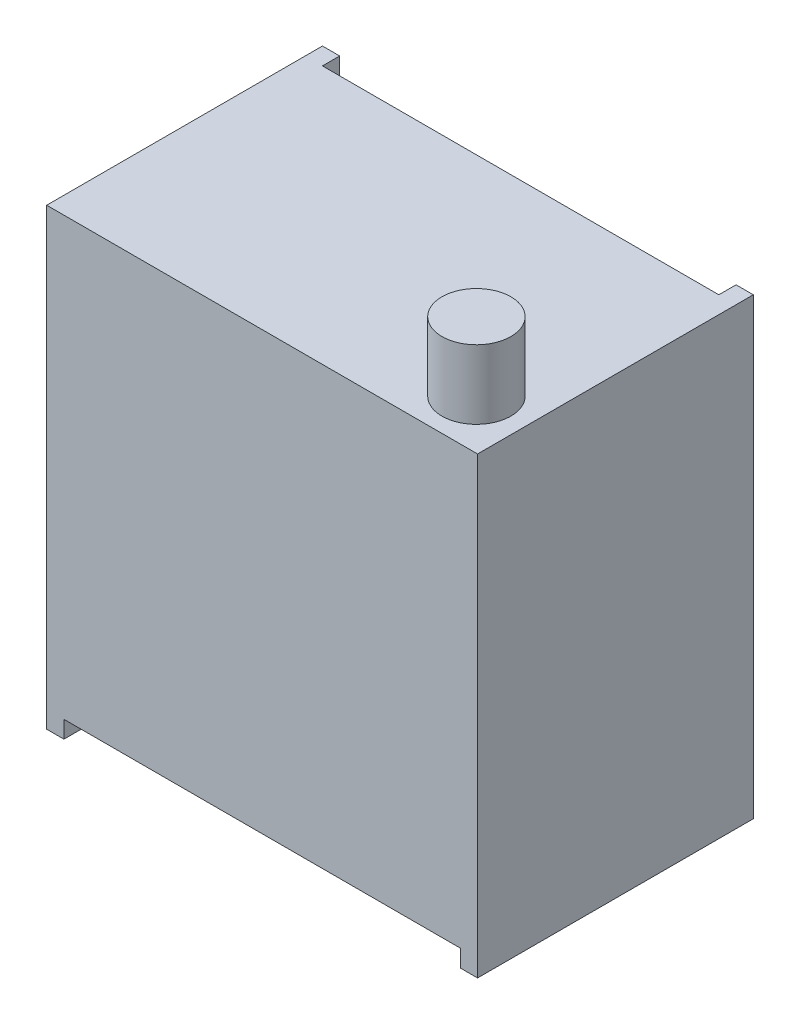
ISO-10303-21;
HEADER;
FILE_DESCRIPTION(('STEP AP214'),'2;1');
FILE_NAME('part.step','',(''),(''),'','','');
FILE_SCHEMA(('AUTOMOTIVE_DESIGN { 1 0 10303 214 1 1 1 1 }'));
ENDSEC;
DATA;
#1=APPLICATION_CONTEXT('core data for automotive mechanical design processes');
#2=APPLICATION_PROTOCOL_DEFINITION('international standard','automotive_design',2000,#1);
#3=PRODUCT_CONTEXT('',#1,'mechanical');
#4=PRODUCT('Part','Part','',(#3));
#5=PRODUCT_RELATED_PRODUCT_CATEGORY('part','',(#4));
#6=PRODUCT_DEFINITION_FORMATION('','',#4);
#7=PRODUCT_DEFINITION_CONTEXT('part definition',#1,'design');
#8=PRODUCT_DEFINITION('design','',#6,#7);
#9=PRODUCT_DEFINITION_SHAPE('','',#8);
#10=(LENGTH_UNIT() NAMED_UNIT(*) SI_UNIT(.MILLI.,.METRE.));
#11=(NAMED_UNIT(*) PLANE_ANGLE_UNIT() SI_UNIT($,.RADIAN.));
#12=(NAMED_UNIT(*) SI_UNIT($,.STERADIAN.) SOLID_ANGLE_UNIT());
#13=UNCERTAINTY_MEASURE_WITH_UNIT(LENGTH_MEASURE(1.E-05),#10,'distance_accuracy_value','');
#14=(GEOMETRIC_REPRESENTATION_CONTEXT(3) GLOBAL_UNCERTAINTY_ASSIGNED_CONTEXT((#13)) GLOBAL_UNIT_ASSIGNED_CONTEXT((#10,
#11,#12)) REPRESENTATION_CONTEXT('',''));
#15=CARTESIAN_POINT('',(0.,0.,0.));
#16=DIRECTION('',(0.,0.,1.));
#17=DIRECTION('',(1.,0.,0.));
#18=AXIS2_PLACEMENT_3D('',#15,#16,#17);
#19=CARTESIAN_POINT('',(4.3815,0.380999999999999,-6.096));
#20=DIRECTION('',(0.,-1.,0.));
#21=DIRECTION('',(0.,0.,-1.));
#22=AXIS2_PLACEMENT_3D('',#19,#20,#21);
#23=PLANE('',#22);
#24=CARTESIAN_POINT('',(0.,0.380999999999999,-4.191));
#25=DIRECTION('',(0.,-1.,0.));
#26=DIRECTION('',(0.,0.,-1.));
#27=AXIS2_PLACEMENT_3D('',#24,#25,#26);
#28=CIRCLE('',#27,0.254);
#29=CARTESIAN_POINT('',(0.,0.380999999999999,-4.445));
#30=VERTEX_POINT('',#29);
#31=EDGE_CURVE('E409',#30,#30,#28,.T.);
#32=ORIENTED_EDGE('',*,*,#31,.F.);
#33=EDGE_LOOP('',(#32));
#34=FACE_BOUND('',#33,.T.);
#35=DIRECTION('',(-1.,0.,0.));
#36=VECTOR('',#35,1.);
#37=CARTESIAN_POINT('',(4.3815,0.380999999999999,-5.715));
#38=LINE('',#37,#36);
#39=CARTESIAN_POINT('',(4.3815,0.380999999999999,-5.715));
#40=VERTEX_POINT('',#39);
#41=CARTESIAN_POINT('',(-4.3815,0.380999999999999,-5.715));
#42=VERTEX_POINT('',#41);
#43=EDGE_CURVE('E136',#40,#42,#38,.T.);
#44=ORIENTED_EDGE('',*,*,#43,.F.);
#45=DIRECTION('',(0.,0.,1.));
#46=VECTOR('',#45,1.);
#47=CARTESIAN_POINT('',(4.3815,0.380999999999999,-6.096));
#48=LINE('',#47,#46);
#49=CARTESIAN_POINT('',(4.3815,0.380999999999999,0.));
#50=VERTEX_POINT('',#49);
#51=EDGE_CURVE('E157',#40,#50,#48,.T.);
#52=ORIENTED_EDGE('',*,*,#51,.T.);
#53=DIRECTION('',(1.,0.,0.));
#54=VECTOR('',#53,1.);
#55=CARTESIAN_POINT('',(4.3815,0.380999999999999,0.));
#56=LINE('',#55,#54);
#57=CARTESIAN_POINT('',(-4.3815,0.380999999999999,0.));
#58=VERTEX_POINT('',#57);
#59=EDGE_CURVE('E142',#58,#50,#56,.T.);
#60=ORIENTED_EDGE('',*,*,#59,.F.);
#61=DIRECTION('',(0.,0.,1.));
#62=VECTOR('',#61,1.);
#63=CARTESIAN_POINT('',(-4.3815,0.380999999999999,-6.096));
#64=LINE('',#63,#62);
#65=EDGE_CURVE('E159',#42,#58,#64,.T.);
#66=ORIENTED_EDGE('',*,*,#65,.F.);
#67=EDGE_LOOP('',(#44,#52,#60,#66));
#68=FACE_BOUND('',#67,.T.);
#69=CARTESIAN_POINT('',(-2.54,0.380999999999999,-4.191));
#70=DIRECTION('',(0.,-1.,0.));
#71=DIRECTION('',(0.,0.,-1.));
#72=AXIS2_PLACEMENT_3D('',#69,#70,#71);
#73=CIRCLE('',#72,0.254);
#74=CARTESIAN_POINT('',(-2.54,0.380999999999999,-4.445));
#75=VERTEX_POINT('',#74);
#76=EDGE_CURVE('E401',#75,#75,#73,.T.);
#77=ORIENTED_EDGE('',*,*,#76,.F.);
#78=EDGE_LOOP('',(#77));
#79=FACE_BOUND('',#78,.T.);
#80=CARTESIAN_POINT('',(2.54,0.380999999999999,-4.191));
#81=DIRECTION('',(0.,-1.,0.));
#82=DIRECTION('',(0.,0.,-1.));
#83=AXIS2_PLACEMENT_3D('',#80,#81,#82);
#84=CIRCLE('',#83,0.254);
#85=CARTESIAN_POINT('',(2.54,0.380999999999999,-4.445));
#86=VERTEX_POINT('',#85);
#87=EDGE_CURVE('E404',#86,#86,#84,.T.);
#88=ORIENTED_EDGE('',*,*,#87,.F.);
#89=EDGE_LOOP('',(#88));
#90=FACE_BOUND('',#89,.T.);
#91=ADVANCED_FACE('F33',(#34,#68,#79,#90),#23,.T.);
#92=CARTESIAN_POINT('',(-4.7625,10.033,-6.096));
#93=DIRECTION('',(0.,1.,0.));
#94=DIRECTION('',(0.,0.,1.));
#95=AXIS2_PLACEMENT_3D('',#92,#93,#94);
#96=PLANE('',#95);
#97=DIRECTION('',(0.,0.,1.));
#98=VECTOR('',#97,1.);
#99=CARTESIAN_POINT('',(-4.3815,10.033,-6.096));
#100=LINE('',#99,#98);
#101=CARTESIAN_POINT('',(-4.3815,10.033,-6.096));
#102=VERTEX_POINT('',#101);
#103=CARTESIAN_POINT('',(-4.3815,10.033,-5.715));
#104=VERTEX_POINT('',#103);
#105=EDGE_CURVE('E186',#102,#104,#100,.T.);
#106=ORIENTED_EDGE('',*,*,#105,.F.);
#107=DIRECTION('',(-1.,0.,0.));
#108=VECTOR('',#107,1.);
#109=CARTESIAN_POINT('',(-4.7625,10.033,-6.096));
#110=LINE('',#109,#108);
#111=CARTESIAN_POINT('',(-4.7625,10.033,-6.096));
#112=VERTEX_POINT('',#111);
#113=EDGE_CURVE('E58',#102,#112,#110,.T.);
#114=ORIENTED_EDGE('',*,*,#113,.T.);
#115=DIRECTION('',(0.,0.,1.));
#116=VECTOR('',#115,1.);
#117=CARTESIAN_POINT('',(-4.7625,10.033,-6.096));
#118=LINE('',#117,#116);
#119=CARTESIAN_POINT('',(-4.7625,10.033,0.));
#120=VERTEX_POINT('',#119);
#121=EDGE_CURVE('E11',#112,#120,#118,.T.);
#122=ORIENTED_EDGE('',*,*,#121,.T.);
#123=DIRECTION('',(-1.,0.,0.));
#124=VECTOR('',#123,1.);
#125=CARTESIAN_POINT('',(-4.7625,10.033,0.));
#126=LINE('',#125,#124);
#127=CARTESIAN_POINT('',(4.7625,10.033,0.));
#128=VERTEX_POINT('',#127);
#129=EDGE_CURVE('E151',#128,#120,#126,.T.);
#130=ORIENTED_EDGE('',*,*,#129,.F.);
#131=DIRECTION('',(0.,0.,1.));
#132=VECTOR('',#131,1.);
#133=CARTESIAN_POINT('',(4.7625,10.033,-6.096));
#134=LINE('',#133,#132);
#135=CARTESIAN_POINT('',(4.7625,10.033,-6.096));
#136=VERTEX_POINT('',#135);
#137=EDGE_CURVE('E42',#136,#128,#134,.T.);
#138=ORIENTED_EDGE('',*,*,#137,.F.);
#139=CARTESIAN_POINT('',(4.3815,10.033,-6.096));
#140=VERTEX_POINT('',#139);
#141=EDGE_CURVE('E123',#136,#140,#110,.T.);
#142=ORIENTED_EDGE('',*,*,#141,.T.);
#143=DIRECTION('',(0.,0.,-1.));
#144=VECTOR('',#143,1.);
#145=CARTESIAN_POINT('',(4.3815,10.033,-6.096));
#146=LINE('',#145,#144);
#147=CARTESIAN_POINT('',(4.3815,10.033,-5.715));
#148=VERTEX_POINT('',#147);
#149=EDGE_CURVE('E173',#148,#140,#146,.T.);
#150=ORIENTED_EDGE('',*,*,#149,.F.);
#151=DIRECTION('',(1.,0.,0.));
#152=VECTOR('',#151,1.);
#153=CARTESIAN_POINT('',(-4.3815,10.033,-5.715));
#154=LINE('',#153,#152);
#155=EDGE_CURVE('E176',#104,#148,#154,.T.);
#156=ORIENTED_EDGE('',*,*,#155,.F.);
#157=EDGE_LOOP('',(#106,#114,#122,#130,#138,#142,#150,#156));
#158=FACE_BOUND('',#157,.T.);
#159=CARTESIAN_POINT('',(3.6449,10.033,-1.0922));
#160=DIRECTION('',(0.,1.,0.));
#161=DIRECTION('',(0.,0.,1.));
#162=AXIS2_PLACEMENT_3D('',#159,#160,#161);
#163=CIRCLE('',#162,0.762);
#164=CARTESIAN_POINT('',(3.6449,10.033,-1.8542));
#165=VERTEX_POINT('',#164);
#166=EDGE_CURVE('E420',#165,#165,#163,.T.);
#167=ORIENTED_EDGE('',*,*,#166,.F.);
#168=EDGE_LOOP('',(#167));
#169=FACE_BOUND('',#168,.T.);
#170=ADVANCED_FACE('F168',(#158,#169),#96,.T.);
#171=CARTESIAN_POINT('',(-4.7625,0.,-6.096));
#172=DIRECTION('',(0.,0.,1.));
#173=DIRECTION('',(1.,0.,0.));
#174=AXIS2_PLACEMENT_3D('',#171,#172,#173);
#175=PLANE('',#174);
#176=ORIENTED_EDGE('',*,*,#113,.F.);
#177=DIRECTION('',(0.,1.,0.));
#178=VECTOR('',#177,1.);
#179=CARTESIAN_POINT('',(-4.3815,0.,-6.096));
#180=LINE('',#179,#178);
#181=CARTESIAN_POINT('',(-4.3815,0.,-6.096));
#182=VERTEX_POINT('',#181);
#183=EDGE_CURVE('E127',#182,#102,#180,.T.);
#184=ORIENTED_EDGE('',*,*,#183,.F.);
#185=DIRECTION('',(1.,0.,0.));
#186=VECTOR('',#185,1.);
#187=CARTESIAN_POINT('',(-4.7625,0.,-6.096));
#188=LINE('',#187,#186);
#189=CARTESIAN_POINT('',(-4.7625,0.,-6.096));
#190=VERTEX_POINT('',#189);
#191=EDGE_CURVE('E194',#190,#182,#188,.T.);
#192=ORIENTED_EDGE('',*,*,#191,.F.);
#193=DIRECTION('',(0.,-1.,0.));
#194=VECTOR('',#193,1.);
#195=CARTESIAN_POINT('',(-4.7625,10.033,-6.096));
#196=LINE('',#195,#194);
#197=EDGE_CURVE('E153',#112,#190,#196,.T.);
#198=ORIENTED_EDGE('',*,*,#197,.F.);
#199=EDGE_LOOP('',(#176,#184,#192,#198));
#200=FACE_BOUND('',#199,.T.);
#201=ADVANCED_FACE('F205',(#200),#175,.F.);
#202=CARTESIAN_POINT('',(-4.7625,10.033,-6.096));
#203=DIRECTION('',(-1.,0.,0.));
#204=DIRECTION('',(0.,-1.,0.));
#205=AXIS2_PLACEMENT_3D('',#202,#203,#204);
#206=PLANE('',#205);
#207=DIRECTION('',(0.,-1.,0.));
#208=VECTOR('',#207,1.);
#209=CARTESIAN_POINT('',(-4.7625,10.033,0.));
#210=LINE('',#209,#208);
#211=CARTESIAN_POINT('',(-4.7625,0.,0.));
#212=VERTEX_POINT('',#211);
#213=EDGE_CURVE('E132',#120,#212,#210,.T.);
#214=ORIENTED_EDGE('',*,*,#213,.F.);
#215=ORIENTED_EDGE('',*,*,#121,.F.);
#216=ORIENTED_EDGE('',*,*,#197,.T.);
#217=DIRECTION('',(0.,0.,1.));
#218=VECTOR('',#217,1.);
#219=CARTESIAN_POINT('',(-4.7625,0.,-6.096));
#220=LINE('',#219,#218);
#221=EDGE_CURVE('E37',#190,#212,#220,.T.);
#222=ORIENTED_EDGE('',*,*,#221,.T.);
#223=EDGE_LOOP('',(#214,#215,#216,#222));
#224=FACE_BOUND('',#223,.T.);
#225=ADVANCED_FACE('F35',(#224),#206,.T.);
#226=CARTESIAN_POINT('',(4.7625,10.033,-6.096));
#227=DIRECTION('',(1.,0.,0.));
#228=DIRECTION('',(0.,1.,0.));
#229=AXIS2_PLACEMENT_3D('',#226,#227,#228);
#230=PLANE('',#229);
#231=DIRECTION('',(0.,1.,0.));
#232=VECTOR('',#231,1.);
#233=CARTESIAN_POINT('',(4.7625,10.033,0.));
#234=LINE('',#233,#232);
#235=CARTESIAN_POINT('',(4.7625,0.,0.));
#236=VERTEX_POINT('',#235);
#237=EDGE_CURVE('E113',#236,#128,#234,.T.);
#238=ORIENTED_EDGE('',*,*,#237,.F.);
#239=DIRECTION('',(0.,0.,1.));
#240=VECTOR('',#239,1.);
#241=CARTESIAN_POINT('',(4.7625,0.,-6.096));
#242=LINE('',#241,#240);
#243=CARTESIAN_POINT('',(4.7625,0.,-6.096));
#244=VERTEX_POINT('',#243);
#245=EDGE_CURVE('E108',#244,#236,#242,.T.);
#246=ORIENTED_EDGE('',*,*,#245,.F.);
#247=DIRECTION('',(0.,1.,0.));
#248=VECTOR('',#247,1.);
#249=CARTESIAN_POINT('',(4.7625,10.033,-6.096));
#250=LINE('',#249,#248);
#251=EDGE_CURVE('E111',#244,#136,#250,.T.);
#252=ORIENTED_EDGE('',*,*,#251,.T.);
#253=ORIENTED_EDGE('',*,*,#137,.T.);
#254=EDGE_LOOP('',(#238,#246,#252,#253));
#255=FACE_BOUND('',#254,.T.);
#256=ADVANCED_FACE('F110',(#255),#230,.T.);
#257=CARTESIAN_POINT('',(4.3815,0.,-6.096));
#258=DIRECTION('',(0.,-1.,0.));
#259=DIRECTION('',(0.,0.,-1.));
#260=AXIS2_PLACEMENT_3D('',#257,#258,#259);
#261=PLANE('',#260);
#262=DIRECTION('',(1.,0.,0.));
#263=VECTOR('',#262,1.);
#264=CARTESIAN_POINT('',(4.3815,0.,0.));
#265=LINE('',#264,#263);
#266=CARTESIAN_POINT('',(4.3815,0.,0.));
#267=VERTEX_POINT('',#266);
#268=EDGE_CURVE('E148',#267,#236,#265,.T.);
#269=ORIENTED_EDGE('',*,*,#268,.F.);
#270=DIRECTION('',(0.,0.,1.));
#271=VECTOR('',#270,1.);
#272=CARTESIAN_POINT('',(4.3815,0.,-6.096));
#273=LINE('',#272,#271);
#274=CARTESIAN_POINT('',(4.3815,0.,-6.096));
#275=VERTEX_POINT('',#274);
#276=EDGE_CURVE('E118',#275,#267,#273,.T.);
#277=ORIENTED_EDGE('',*,*,#276,.F.);
#278=DIRECTION('',(1.,0.,0.));
#279=VECTOR('',#278,1.);
#280=CARTESIAN_POINT('',(4.3815,0.,-6.096));
#281=LINE('',#280,#279);
#282=EDGE_CURVE('E121',#275,#244,#281,.T.);
#283=ORIENTED_EDGE('',*,*,#282,.T.);
#284=ORIENTED_EDGE('',*,*,#245,.T.);
#285=EDGE_LOOP('',(#269,#277,#283,#284));
#286=FACE_BOUND('',#285,.T.);
#287=ADVANCED_FACE('F125',(#286),#261,.T.);
#288=CARTESIAN_POINT('',(4.3815,0.,-6.096));
#289=DIRECTION('',(-1.,0.,0.));
#290=DIRECTION('',(0.,0.,1.));
#291=AXIS2_PLACEMENT_3D('',#288,#289,#290);
#292=PLANE('',#291);
#293=ORIENTED_EDGE('',*,*,#51,.F.);
#294=DIRECTION('',(0.,1.,0.));
#295=VECTOR('',#294,1.);
#296=CARTESIAN_POINT('',(4.3815,0.,-5.715));
#297=LINE('',#296,#295);
#298=EDGE_CURVE('E184',#40,#148,#297,.T.);
#299=ORIENTED_EDGE('',*,*,#298,.T.);
#300=ORIENTED_EDGE('',*,*,#149,.T.);
#301=DIRECTION('',(0.,-1.,0.));
#302=VECTOR('',#301,1.);
#303=CARTESIAN_POINT('',(4.3815,0.,-6.096));
#304=LINE('',#303,#302);
#305=EDGE_CURVE('E50',#140,#275,#304,.T.);
#306=ORIENTED_EDGE('',*,*,#305,.T.);
#307=ORIENTED_EDGE('',*,*,#276,.T.);
#308=DIRECTION('',(0.,-1.,0.));
#309=VECTOR('',#308,1.);
#310=CARTESIAN_POINT('',(4.3815,0.,0.));
#311=LINE('',#310,#309);
#312=EDGE_CURVE('E145',#50,#267,#311,.T.);
#313=ORIENTED_EDGE('',*,*,#312,.F.);
#314=EDGE_LOOP('',(#293,#299,#300,#306,#307,#313));
#315=FACE_BOUND('',#314,.T.);
#316=ADVANCED_FACE('F225',(#315),#292,.T.);
#317=CARTESIAN_POINT('',(-4.3815,0.,-6.096));
#318=DIRECTION('',(1.,0.,0.));
#319=DIRECTION('',(0.,0.,-1.));
#320=AXIS2_PLACEMENT_3D('',#317,#318,#319);
#321=PLANE('',#320);
#322=DIRECTION('',(0.,1.,0.));
#323=VECTOR('',#322,1.);
#324=CARTESIAN_POINT('',(-4.3815,0.,0.));
#325=LINE('',#324,#323);
#326=CARTESIAN_POINT('',(-4.3815,0.,0.));
#327=VERTEX_POINT('',#326);
#328=EDGE_CURVE('E139',#327,#58,#325,.T.);
#329=ORIENTED_EDGE('',*,*,#328,.F.);
#330=DIRECTION('',(0.,0.,1.));
#331=VECTOR('',#330,1.);
#332=CARTESIAN_POINT('',(-4.3815,0.,-6.096));
#333=LINE('',#332,#331);
#334=EDGE_CURVE('E160',#182,#327,#333,.T.);
#335=ORIENTED_EDGE('',*,*,#334,.F.);
#336=ORIENTED_EDGE('',*,*,#183,.T.);
#337=ORIENTED_EDGE('',*,*,#105,.T.);
#338=DIRECTION('',(0.,1.,0.));
#339=VECTOR('',#338,1.);
#340=CARTESIAN_POINT('',(-4.3815,0.,-5.715));
#341=LINE('',#340,#339);
#342=EDGE_CURVE('E181',#42,#104,#341,.T.);
#343=ORIENTED_EDGE('',*,*,#342,.F.);
#344=ORIENTED_EDGE('',*,*,#65,.T.);
#345=EDGE_LOOP('',(#329,#335,#336,#337,#343,#344));
#346=FACE_BOUND('',#345,.T.);
#347=ADVANCED_FACE('F199',(#346),#321,.T.);
#348=CARTESIAN_POINT('',(-4.7625,0.,-6.096));
#349=DIRECTION('',(0.,-1.,0.));
#350=DIRECTION('',(0.,0.,-1.));
#351=AXIS2_PLACEMENT_3D('',#348,#349,#350);
#352=PLANE('',#351);
#353=DIRECTION('',(1.,0.,0.));
#354=VECTOR('',#353,1.);
#355=CARTESIAN_POINT('',(-4.7625,0.,0.));
#356=LINE('',#355,#354);
#357=EDGE_CURVE('E135',#212,#327,#356,.T.);
#358=ORIENTED_EDGE('',*,*,#357,.F.);
#359=ORIENTED_EDGE('',*,*,#221,.F.);
#360=ORIENTED_EDGE('',*,*,#191,.T.);
#361=ORIENTED_EDGE('',*,*,#334,.T.);
#362=EDGE_LOOP('',(#358,#359,#360,#361));
#363=FACE_BOUND('',#362,.T.);
#364=ADVANCED_FACE('F165',(#363),#352,.T.);
#365=ORIENTED_EDGE('',*,*,#305,.F.);
#366=ORIENTED_EDGE('',*,*,#141,.F.);
#367=ORIENTED_EDGE('',*,*,#251,.F.);
#368=ORIENTED_EDGE('',*,*,#282,.F.);
#369=EDGE_LOOP('',(#365,#366,#367,#368));
#370=FACE_BOUND('',#369,.T.);
#371=ADVANCED_FACE('F120',(#370),#175,.F.);
#372=CARTESIAN_POINT('',(-4.7625,0.,0.));
#373=DIRECTION('',(0.,0.,1.));
#374=DIRECTION('',(1.,0.,0.));
#375=AXIS2_PLACEMENT_3D('',#372,#373,#374);
#376=PLANE('',#375);
#377=ORIENTED_EDGE('',*,*,#213,.T.);
#378=ORIENTED_EDGE('',*,*,#357,.T.);
#379=ORIENTED_EDGE('',*,*,#328,.T.);
#380=ORIENTED_EDGE('',*,*,#59,.T.);
#381=ORIENTED_EDGE('',*,*,#312,.T.);
#382=ORIENTED_EDGE('',*,*,#268,.T.);
#383=ORIENTED_EDGE('',*,*,#237,.T.);
#384=ORIENTED_EDGE('',*,*,#129,.T.);
#385=EDGE_LOOP('',(#377,#378,#379,#380,#381,#382,#383,#384));
#386=FACE_BOUND('',#385,.T.);
#387=ADVANCED_FACE('F167',(#386),#376,.T.);
#388=CARTESIAN_POINT('',(-4.3815,0.,-5.715));
#389=DIRECTION('',(0.,0.,1.));
#390=DIRECTION('',(1.,0.,0.));
#391=AXIS2_PLACEMENT_3D('',#388,#389,#390);
#392=PLANE('',#391);
#393=ORIENTED_EDGE('',*,*,#43,.T.);
#394=ORIENTED_EDGE('',*,*,#342,.T.);
#395=ORIENTED_EDGE('',*,*,#155,.T.);
#396=ORIENTED_EDGE('',*,*,#298,.F.);
#397=EDGE_LOOP('',(#393,#394,#395,#396));
#398=FACE_BOUND('',#397,.T.);
#399=ADVANCED_FACE('F245',(#398),#392,.F.);
#400=CARTESIAN_POINT('',(3.6449,11.557,-1.0922));
#401=DIRECTION('',(0.,-1.,0.));
#402=DIRECTION('',(0.,0.,-1.));
#403=AXIS2_PLACEMENT_3D('',#400,#401,#402);
#404=CYLINDRICAL_SURFACE('',#403,0.762);
#405=CARTESIAN_POINT('',(3.6449,11.557,-1.0922));
#406=DIRECTION('',(0.,1.,0.));
#407=DIRECTION('',(0.,0.,1.));
#408=AXIS2_PLACEMENT_3D('',#405,#406,#407);
#409=CIRCLE('',#408,0.762);
#410=CARTESIAN_POINT('',(3.6449,11.557,-1.8542));
#411=VERTEX_POINT('',#410);
#412=EDGE_CURVE('E204',#411,#411,#409,.T.);
#413=CARTESIAN_POINT('',(3.6449,11.557,-1.8542));
#414=CARTESIAN_POINT('',(3.6449,11.541125,-1.8542));
#415=CARTESIAN_POINT('',(3.6449,11.52525,-1.8542));
#416=CARTESIAN_POINT('',(3.6449,11.4935,-1.8542));
#417=CARTESIAN_POINT('',(3.6449,11.477625,-1.8542));
#418=CARTESIAN_POINT('',(3.6449,11.445875,-1.8542));
#419=CARTESIAN_POINT('',(3.6449,11.43,-1.8542));
#420=CARTESIAN_POINT('',(3.6449,11.39825,-1.8542));
#421=CARTESIAN_POINT('',(3.6449,11.382375,-1.8542));
#422=CARTESIAN_POINT('',(3.6449,11.350625,-1.8542));
#423=CARTESIAN_POINT('',(3.6449,11.33475,-1.8542));
#424=CARTESIAN_POINT('',(3.6449,11.303,-1.8542));
#425=CARTESIAN_POINT('',(3.6449,11.287125,-1.8542));
#426=CARTESIAN_POINT('',(3.6449,11.255375,-1.8542));
#427=CARTESIAN_POINT('',(3.6449,11.2395,-1.8542));
#428=CARTESIAN_POINT('',(3.6449,11.20775,-1.8542));
#429=CARTESIAN_POINT('',(3.6449,11.191875,-1.8542));
#430=CARTESIAN_POINT('',(3.6449,11.160125,-1.8542));
#431=CARTESIAN_POINT('',(3.6449,11.14425,-1.8542));
#432=CARTESIAN_POINT('',(3.6449,11.1125,-1.8542));
#433=CARTESIAN_POINT('',(3.6449,11.096625,-1.8542));
#434=CARTESIAN_POINT('',(3.6449,11.064875,-1.8542));
#435=CARTESIAN_POINT('',(3.6449,11.049,-1.8542));
#436=CARTESIAN_POINT('',(3.6449,11.01725,-1.8542));
#437=CARTESIAN_POINT('',(3.6449,11.001375,-1.8542));
#438=CARTESIAN_POINT('',(3.6449,10.969625,-1.8542));
#439=CARTESIAN_POINT('',(3.6449,10.95375,-1.8542));
#440=CARTESIAN_POINT('',(3.6449,10.922,-1.8542));
#441=CARTESIAN_POINT('',(3.6449,10.906125,-1.8542));
#442=CARTESIAN_POINT('',(3.6449,10.874375,-1.8542));
#443=CARTESIAN_POINT('',(3.6449,10.8585,-1.8542));
#444=CARTESIAN_POINT('',(3.6449,10.82675,-1.8542));
#445=CARTESIAN_POINT('',(3.6449,10.810875,-1.8542));
#446=CARTESIAN_POINT('',(3.6449,10.779125,-1.8542));
#447=CARTESIAN_POINT('',(3.6449,10.76325,-1.8542));
#448=CARTESIAN_POINT('',(3.6449,10.7315,-1.8542));
#449=CARTESIAN_POINT('',(3.6449,10.715625,-1.8542));
#450=CARTESIAN_POINT('',(3.6449,10.683875,-1.8542));
#451=CARTESIAN_POINT('',(3.6449,10.668,-1.8542));
#452=CARTESIAN_POINT('',(3.6449,10.63625,-1.8542));
#453=CARTESIAN_POINT('',(3.6449,10.620375,-1.8542));
#454=CARTESIAN_POINT('',(3.6449,10.588625,-1.8542));
#455=CARTESIAN_POINT('',(3.6449,10.57275,-1.8542));
#456=CARTESIAN_POINT('',(3.6449,10.541,-1.8542));
#457=CARTESIAN_POINT('',(3.6449,10.525125,-1.8542));
#458=CARTESIAN_POINT('',(3.6449,10.493375,-1.8542));
#459=CARTESIAN_POINT('',(3.6449,10.4775,-1.8542));
#460=CARTESIAN_POINT('',(3.6449,10.44575,-1.8542));
#461=CARTESIAN_POINT('',(3.6449,10.429875,-1.8542));
#462=CARTESIAN_POINT('',(3.6449,10.398125,-1.8542));
#463=CARTESIAN_POINT('',(3.6449,10.38225,-1.8542));
#464=CARTESIAN_POINT('',(3.6449,10.3505,-1.8542));
#465=CARTESIAN_POINT('',(3.6449,10.334625,-1.8542));
#466=CARTESIAN_POINT('',(3.6449,10.302875,-1.8542));
#467=CARTESIAN_POINT('',(3.6449,10.287,-1.8542));
#468=CARTESIAN_POINT('',(3.6449,10.25525,-1.8542));
#469=CARTESIAN_POINT('',(3.6449,10.239375,-1.8542));
#470=CARTESIAN_POINT('',(3.6449,10.207625,-1.8542));
#471=CARTESIAN_POINT('',(3.6449,10.19175,-1.8542));
#472=CARTESIAN_POINT('',(3.6449,10.16,-1.8542));
#473=CARTESIAN_POINT('',(3.6449,10.144125,-1.8542));
#474=CARTESIAN_POINT('',(3.6449,10.112375,-1.8542));
#475=CARTESIAN_POINT('',(3.6449,10.0965,-1.8542));
#476=CARTESIAN_POINT('',(3.6449,10.06475,-1.8542));
#477=CARTESIAN_POINT('',(3.6449,10.048875,-1.8542));
#478=CARTESIAN_POINT('',(3.6449,10.033,-1.8542));
#479=B_SPLINE_CURVE_WITH_KNOTS('',3,(#413,#414,#415,#416,#417,#418,#419,#420,#421,#422,#423,
#424,#425,#426,#427,#428,#429,#430,#431,#432,#433,#434,#435,#436,#437,#438,#439,#440,#441,#442,
#443,#444,#445,#446,#447,#448,#449,#450,#451,#452,#453,#454,#455,#456,#457,#458,#459,#460,#461,
#462,#463,#464,#465,#466,#467,#468,#469,#470,#471,#472,#473,#474,#475,#476,#477,#478),
.UNSPECIFIED.,.F.,.F.,(4,2,2,2,2,2,2,2,2,2,2,2,2,2,2,2,2,2,2,2,2,2,2,2,2,2,2,2,2,2,2,2,4),(0.,
0.0476249999999991,0.0952499999999998,0.142874999999999,0.1905,0.238124999999999,0.28575,
0.333374999999999,0.380999999999999,0.428624999999998,0.476249999999999,0.523874999999998,
0.571499999999999,0.619124999999998,0.666749999999999,0.714374999999998,0.761999999999999,
0.809624999999998,0.857249999999999,0.904874999999999,0.952499999999998,1.000125,1.04775,
1.095375,1.143,1.190625,1.23825,1.285875,1.3335,1.381125,1.42875,1.476375,1.524),.UNSPECIFIED.);
#480=EDGE_CURVE('BSEAM251',#411,#165,#479,.T.);
#481=ORIENTED_EDGE('',*,*,#412,.F.);
#482=ORIENTED_EDGE('',*,*,#166,.T.);
#483=ORIENTED_EDGE('',*,*,#480,.T.);
#484=ORIENTED_EDGE('',*,*,#480,.F.);
#485=EDGE_LOOP('',(#481,#483,#482,#484));
#486=FACE_BOUND('',#485,.T.);
#487=ADVANCED_FACE('F251',(#486),#404,.T.);
#488=CARTESIAN_POINT('',(3.6449,11.557,-1.0922));
#489=DIRECTION('',(0.,1.,0.));
#490=DIRECTION('',(0.,0.,1.));
#491=AXIS2_PLACEMENT_3D('',#488,#489,#490);
#492=PLANE('',#491);
#493=ORIENTED_EDGE('',*,*,#412,.T.);
#494=EDGE_LOOP('',(#493));
#495=FACE_BOUND('',#494,.T.);
#496=ADVANCED_FACE('F259',(#495),#492,.T.);
#497=CARTESIAN_POINT('',(-2.54,-1.143,-4.191));
#498=DIRECTION('',(0.,1.,0.));
#499=DIRECTION('',(0.,0.,1.));
#500=AXIS2_PLACEMENT_3D('',#497,#498,#499);
#501=CYLINDRICAL_SURFACE('',#500,0.254);
#502=CARTESIAN_POINT('',(-2.54,-1.143,-4.191));
#503=DIRECTION('',(0.,-1.,0.));
#504=DIRECTION('',(0.,0.,-1.));
#505=AXIS2_PLACEMENT_3D('',#502,#503,#504);
#506=CIRCLE('',#505,0.254);
#507=CARTESIAN_POINT('',(-2.54,-1.143,-4.445));
#508=VERTEX_POINT('',#507);
#509=EDGE_CURVE('E417',#508,#508,#506,.T.);
#510=ORIENTED_EDGE('',*,*,#509,.F.);
#511=EDGE_LOOP('',(#510));
#512=FACE_BOUND('',#511,.T.);
#513=ORIENTED_EDGE('',*,*,#76,.T.);
#514=EDGE_LOOP('',(#513));
#515=FACE_BOUND('',#514,.T.);
#516=ADVANCED_FACE('F267',(#512,#515),#501,.T.);
#517=CARTESIAN_POINT('',(-2.54,-1.143,-4.191));
#518=DIRECTION('',(0.,-1.,0.));
#519=DIRECTION('',(0.,0.,-1.));
#520=AXIS2_PLACEMENT_3D('',#517,#518,#519);
#521=PLANE('',#520);
#522=ORIENTED_EDGE('',*,*,#509,.T.);
#523=EDGE_LOOP('',(#522));
#524=FACE_BOUND('',#523,.T.);
#525=ADVANCED_FACE('F275',(#524),#521,.T.);
#526=CARTESIAN_POINT('',(0.,-1.143,-4.191));
#527=DIRECTION('',(0.,1.,0.));
#528=DIRECTION('',(0.,0.,1.));
#529=AXIS2_PLACEMENT_3D('',#526,#527,#528);
#530=CYLINDRICAL_SURFACE('',#529,0.254);
#531=CARTESIAN_POINT('',(0.,-1.143,-4.191));
#532=DIRECTION('',(0.,-1.,0.));
#533=DIRECTION('',(0.,0.,-1.));
#534=AXIS2_PLACEMENT_3D('',#531,#532,#533);
#535=CIRCLE('',#534,0.254);
#536=CARTESIAN_POINT('',(0.,-1.143,-4.445));
#537=VERTEX_POINT('',#536);
#538=EDGE_CURVE('E412',#537,#537,#535,.T.);
#539=ORIENTED_EDGE('',*,*,#538,.F.);
#540=EDGE_LOOP('',(#539));
#541=FACE_BOUND('',#540,.T.);
#542=ORIENTED_EDGE('',*,*,#31,.T.);
#543=EDGE_LOOP('',(#542));
#544=FACE_BOUND('',#543,.T.);
#545=ADVANCED_FACE('F283',(#541,#544),#530,.T.);
#546=CARTESIAN_POINT('',(0.,-1.143,-4.191));
#547=DIRECTION('',(0.,-1.,0.));
#548=DIRECTION('',(0.,0.,-1.));
#549=AXIS2_PLACEMENT_3D('',#546,#547,#548);
#550=PLANE('',#549);
#551=ORIENTED_EDGE('',*,*,#538,.T.);
#552=EDGE_LOOP('',(#551));
#553=FACE_BOUND('',#552,.T.);
#554=ADVANCED_FACE('F291',(#553),#550,.T.);
#555=CARTESIAN_POINT('',(2.54,-1.143,-4.191));
#556=DIRECTION('',(0.,1.,0.));
#557=DIRECTION('',(0.,0.,1.));
#558=AXIS2_PLACEMENT_3D('',#555,#556,#557);
#559=CYLINDRICAL_SURFACE('',#558,0.254);
#560=CARTESIAN_POINT('',(2.54,-1.143,-4.191));
#561=DIRECTION('',(0.,-1.,0.));
#562=DIRECTION('',(0.,0.,-1.));
#563=AXIS2_PLACEMENT_3D('',#560,#561,#562);
#564=CIRCLE('',#563,0.254);
#565=CARTESIAN_POINT('',(2.54,-1.143,-4.445));
#566=VERTEX_POINT('',#565);
#567=EDGE_CURVE('E406',#566,#566,#564,.T.);
#568=ORIENTED_EDGE('',*,*,#567,.F.);
#569=EDGE_LOOP('',(#568));
#570=FACE_BOUND('',#569,.T.);
#571=ORIENTED_EDGE('',*,*,#87,.T.);
#572=EDGE_LOOP('',(#571));
#573=FACE_BOUND('',#572,.T.);
#574=ADVANCED_FACE('F299',(#570,#573),#559,.T.);
#575=CARTESIAN_POINT('',(2.54,-1.143,-4.191));
#576=DIRECTION('',(0.,-1.,0.));
#577=DIRECTION('',(0.,0.,-1.));
#578=AXIS2_PLACEMENT_3D('',#575,#576,#577);
#579=PLANE('',#578);
#580=ORIENTED_EDGE('',*,*,#567,.T.);
#581=EDGE_LOOP('',(#580));
#582=FACE_BOUND('',#581,.T.);
#583=ADVANCED_FACE('F307',(#582),#579,.T.);
#584=CLOSED_SHELL('',(#91,#170,#201,#225,#256,#287,#316,#347,#364,#371,#387,#399,#487,#496,#516,
#525,#545,#554,#574,#583));
#585=MANIFOLD_SOLID_BREP('B2',#584);
#586=ADVANCED_BREP_SHAPE_REPRESENTATION('',(#18,#585),#14);
#587=SHAPE_DEFINITION_REPRESENTATION(#9,#586);
ENDSEC;
END-ISO-10303-21;
